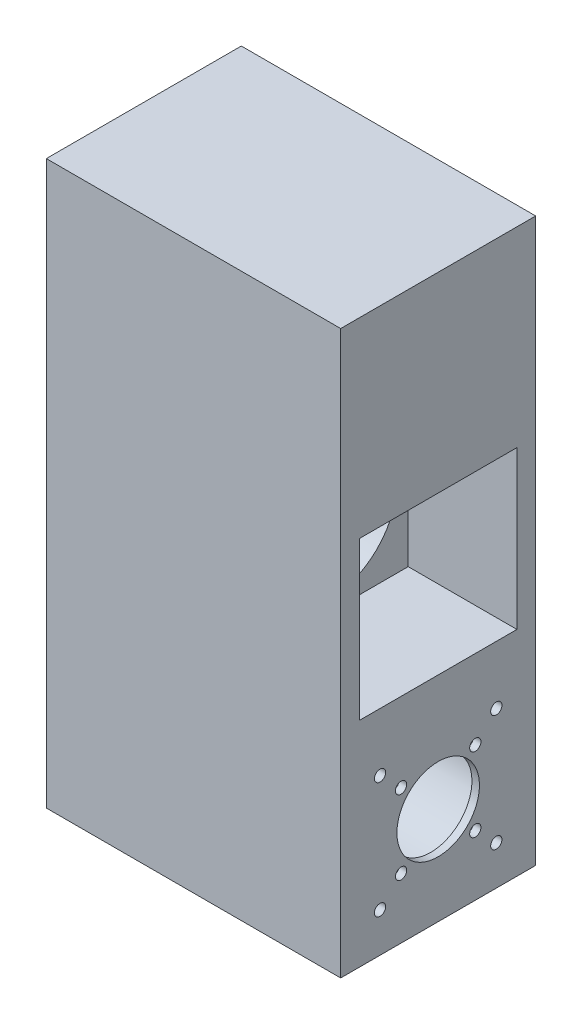
ISO-10303-21;
HEADER;
FILE_DESCRIPTION(('STEP AP214'),'2;1');
FILE_NAME('part.step','',(''),(''),'','','');
FILE_SCHEMA(('AUTOMOTIVE_DESIGN { 1 0 10303 214 1 1 1 1 }'));
ENDSEC;
DATA;
#1=APPLICATION_CONTEXT('core data for automotive mechanical design processes');
#2=APPLICATION_PROTOCOL_DEFINITION('international standard','automotive_design',2000,#1);
#3=PRODUCT_CONTEXT('',#1,'mechanical');
#4=PRODUCT('Part','Part','',(#3));
#5=PRODUCT_RELATED_PRODUCT_CATEGORY('part','',(#4));
#6=PRODUCT_DEFINITION_FORMATION('','',#4);
#7=PRODUCT_DEFINITION_CONTEXT('part definition',#1,'design');
#8=PRODUCT_DEFINITION('design','',#6,#7);
#9=PRODUCT_DEFINITION_SHAPE('','',#8);
#10=(LENGTH_UNIT() NAMED_UNIT(*) SI_UNIT(.MILLI.,.METRE.));
#11=(NAMED_UNIT(*) PLANE_ANGLE_UNIT() SI_UNIT($,.RADIAN.));
#12=(NAMED_UNIT(*) SI_UNIT($,.STERADIAN.) SOLID_ANGLE_UNIT());
#13=UNCERTAINTY_MEASURE_WITH_UNIT(LENGTH_MEASURE(1.E-05),#10,'distance_accuracy_value','');
#14=(GEOMETRIC_REPRESENTATION_CONTEXT(3) GLOBAL_UNCERTAINTY_ASSIGNED_CONTEXT((#13)) GLOBAL_UNIT_ASSIGNED_CONTEXT((#10,
#11,#12)) REPRESENTATION_CONTEXT('',''));
#15=CARTESIAN_POINT('',(0.,0.,0.));
#16=DIRECTION('',(0.,0.,1.));
#17=DIRECTION('',(1.,0.,0.));
#18=AXIS2_PLACEMENT_3D('',#15,#16,#17);
#19=CARTESIAN_POINT('',(-39.25,150.,-26.));
#20=DIRECTION('',(1.,0.,0.));
#21=DIRECTION('',(0.,0.,-1.));
#22=AXIS2_PLACEMENT_3D('',#19,#20,#21);
#23=PLANE('',#22);
#24=DIRECTION('',(0.,0.,1.));
#25=VECTOR('',#24,1.);
#26=CARTESIAN_POINT('',(-39.25,0.,-26.));
#27=LINE('',#26,#25);
#28=CARTESIAN_POINT('',(-39.25,0.,-26.));
#29=VERTEX_POINT('',#28);
#30=CARTESIAN_POINT('',(-39.25,0.,26.));
#31=VERTEX_POINT('',#30);
#32=EDGE_CURVE('E405',#29,#31,#27,.T.);
#33=ORIENTED_EDGE('',*,*,#32,.T.);
#34=DIRECTION('',(0.,-1.,0.));
#35=VECTOR('',#34,1.);
#36=CARTESIAN_POINT('',(-39.25,150.,26.));
#37=LINE('',#36,#35);
#38=CARTESIAN_POINT('',(-39.25,150.,26.));
#39=VERTEX_POINT('',#38);
#40=EDGE_CURVE('E413',#39,#31,#37,.T.);
#41=ORIENTED_EDGE('',*,*,#40,.F.);
#42=DIRECTION('',(0.,0.,1.));
#43=VECTOR('',#42,1.);
#44=CARTESIAN_POINT('',(-39.25,150.,-26.));
#45=LINE('',#44,#43);
#46=CARTESIAN_POINT('',(-39.25,150.,-26.));
#47=VERTEX_POINT('',#46);
#48=EDGE_CURVE('E392',#47,#39,#45,.T.);
#49=ORIENTED_EDGE('',*,*,#48,.F.);
#50=DIRECTION('',(0.,-1.,0.));
#51=VECTOR('',#50,1.);
#52=CARTESIAN_POINT('',(-39.25,150.,-26.));
#53=LINE('',#52,#51);
#54=EDGE_CURVE('E50',#47,#29,#53,.T.);
#55=ORIENTED_EDGE('',*,*,#54,.T.);
#56=EDGE_LOOP('',(#33,#41,#49,#55));
#57=FACE_BOUND('',#56,.T.);
#58=DIRECTION('',(0.,-1.,0.));
#59=VECTOR('',#58,1.);
#60=CARTESIAN_POINT('',(-39.25,47.,21.));
#61=LINE('',#60,#59);
#62=CARTESIAN_POINT('',(-39.25,47.,21.));
#63=VERTEX_POINT('',#62);
#64=CARTESIAN_POINT('',(-39.25,5.,21.));
#65=VERTEX_POINT('',#64);
#66=EDGE_CURVE('E360',#63,#65,#61,.T.);
#67=ORIENTED_EDGE('',*,*,#66,.T.);
#68=DIRECTION('',(0.,0.,1.));
#69=VECTOR('',#68,1.);
#70=CARTESIAN_POINT('',(-39.25,4.99999999999999,-21.));
#71=LINE('',#70,#69);
#72=CARTESIAN_POINT('',(-39.25,4.99999999999999,-21.));
#73=VERTEX_POINT('',#72);
#74=EDGE_CURVE('E338',#73,#65,#71,.T.);
#75=ORIENTED_EDGE('',*,*,#74,.F.);
#76=DIRECTION('',(0.,-1.,0.));
#77=VECTOR('',#76,1.);
#78=CARTESIAN_POINT('',(-39.25,47.,-21.));
#79=LINE('',#78,#77);
#80=CARTESIAN_POINT('',(-39.25,47.,-21.));
#81=VERTEX_POINT('',#80);
#82=EDGE_CURVE('E347',#81,#73,#79,.T.);
#83=ORIENTED_EDGE('',*,*,#82,.F.);
#84=DIRECTION('',(0.,0.,1.));
#85=VECTOR('',#84,1.);
#86=CARTESIAN_POINT('',(-39.25,47.,-21.));
#87=LINE('',#86,#85);
#88=EDGE_CURVE('E364',#81,#63,#87,.T.);
#89=ORIENTED_EDGE('',*,*,#88,.T.);
#90=EDGE_LOOP('',(#67,#75,#83,#89));
#91=FACE_BOUND('',#90,.T.);
#92=DIRECTION('',(0.,-1.,0.));
#93=VECTOR('',#92,1.);
#94=CARTESIAN_POINT('',(-39.25,0.,21.));
#95=LINE('',#94,#93);
#96=CARTESIAN_POINT('',(-39.25,145.,21.));
#97=VERTEX_POINT('',#96);
#98=CARTESIAN_POINT('',(-39.25,57.,21.));
#99=VERTEX_POINT('',#98);
#100=EDGE_CURVE('E65',#97,#99,#95,.T.);
#101=ORIENTED_EDGE('',*,*,#100,.T.);
#102=DIRECTION('',(0.,0.,1.));
#103=VECTOR('',#102,1.);
#104=CARTESIAN_POINT('',(-39.25,57.,0.));
#105=LINE('',#104,#103);
#106=CARTESIAN_POINT('',(-39.25,57.,-21.));
#107=VERTEX_POINT('',#106);
#108=EDGE_CURVE('E225',#107,#99,#105,.T.);
#109=ORIENTED_EDGE('',*,*,#108,.F.);
#110=DIRECTION('',(0.,-1.,0.));
#111=VECTOR('',#110,1.);
#112=CARTESIAN_POINT('',(-39.25,0.,-21.));
#113=LINE('',#112,#111);
#114=CARTESIAN_POINT('',(-39.25,145.,-21.));
#115=VERTEX_POINT('',#114);
#116=EDGE_CURVE('E243',#115,#107,#113,.T.);
#117=ORIENTED_EDGE('',*,*,#116,.F.);
#118=DIRECTION('',(0.,0.,1.));
#119=VECTOR('',#118,1.);
#120=CARTESIAN_POINT('',(-39.25,145.,0.));
#121=LINE('',#120,#119);
#122=EDGE_CURVE('E239',#115,#97,#121,.T.);
#123=ORIENTED_EDGE('',*,*,#122,.T.);
#124=EDGE_LOOP('',(#101,#109,#117,#123));
#125=FACE_BOUND('',#124,.T.);
#126=ADVANCED_FACE('F41',(#57,#91,#125),#23,.F.);
#127=CARTESIAN_POINT('',(39.25,150.,-26.));
#128=DIRECTION('',(-1.,0.,0.));
#129=DIRECTION('',(0.,0.,1.));
#130=AXIS2_PLACEMENT_3D('',#127,#128,#129);
#131=PLANE('',#130);
#132=DIRECTION('',(0.,1.,0.));
#133=VECTOR('',#132,1.);
#134=CARTESIAN_POINT('',(39.25,0.,-21.));
#135=LINE('',#134,#133);
#136=CARTESIAN_POINT('',(39.25,57.,-21.));
#137=VERTEX_POINT('',#136);
#138=CARTESIAN_POINT('',(39.25,99.,-21.));
#139=VERTEX_POINT('',#138);
#140=EDGE_CURVE('E616',#137,#139,#135,.T.);
#141=ORIENTED_EDGE('',*,*,#140,.F.);
#142=DIRECTION('',(0.,0.,-1.));
#143=VECTOR('',#142,1.);
#144=CARTESIAN_POINT('',(39.25,57.,0.));
#145=LINE('',#144,#143);
#146=CARTESIAN_POINT('',(39.25,57.,21.));
#147=VERTEX_POINT('',#146);
#148=EDGE_CURVE('E188',#147,#137,#145,.T.);
#149=ORIENTED_EDGE('',*,*,#148,.F.);
#150=DIRECTION('',(0.,-1.,0.));
#151=VECTOR('',#150,1.);
#152=CARTESIAN_POINT('',(39.25,0.,21.));
#153=LINE('',#152,#151);
#154=CARTESIAN_POINT('',(39.25,99.,21.));
#155=VERTEX_POINT('',#154);
#156=EDGE_CURVE('E159',#155,#147,#153,.T.);
#157=ORIENTED_EDGE('',*,*,#156,.F.);
#158=DIRECTION('',(0.,0.,-1.));
#159=VECTOR('',#158,1.);
#160=CARTESIAN_POINT('',(39.25,99.,0.));
#161=LINE('',#160,#159);
#162=EDGE_CURVE('E197',#155,#139,#161,.T.);
#163=ORIENTED_EDGE('',*,*,#162,.T.);
#164=EDGE_LOOP('',(#141,#149,#157,#163));
#165=FACE_BOUND('',#164,.T.);
#166=CARTESIAN_POINT('',(39.25,41.5,-15.5));
#167=DIRECTION('',(1.,0.,0.));
#168=DIRECTION('',(0.,0.,-1.));
#169=AXIS2_PLACEMENT_3D('',#166,#167,#168);
#170=CIRCLE('',#169,1.5);
#171=CARTESIAN_POINT('',(39.25,41.5,-17.));
#172=VERTEX_POINT('',#171);
#173=EDGE_CURVE('E274',#172,#172,#170,.T.);
#174=ORIENTED_EDGE('',*,*,#173,.F.);
#175=EDGE_LOOP('',(#174));
#176=FACE_BOUND('',#175,.T.);
#177=CARTESIAN_POINT('',(39.25,10.5,15.5));
#178=DIRECTION('',(1.,0.,0.));
#179=DIRECTION('',(0.,0.,-1.));
#180=AXIS2_PLACEMENT_3D('',#177,#178,#179);
#181=CIRCLE('',#180,1.5);
#182=CARTESIAN_POINT('',(39.25,10.5,14.));
#183=VERTEX_POINT('',#182);
#184=EDGE_CURVE('E275',#183,#183,#181,.T.);
#185=ORIENTED_EDGE('',*,*,#184,.F.);
#186=EDGE_LOOP('',(#185));
#187=FACE_BOUND('',#186,.T.);
#188=CARTESIAN_POINT('',(39.25,10.5,-15.5));
#189=DIRECTION('',(1.,0.,0.));
#190=DIRECTION('',(0.,0.,-1.));
#191=AXIS2_PLACEMENT_3D('',#188,#189,#190);
#192=CIRCLE('',#191,1.5);
#193=CARTESIAN_POINT('',(39.25,10.5,-17.));
#194=VERTEX_POINT('',#193);
#195=EDGE_CURVE('E265',#194,#194,#192,.T.);
#196=ORIENTED_EDGE('',*,*,#195,.F.);
#197=EDGE_LOOP('',(#196));
#198=FACE_BOUND('',#197,.T.);
#199=CARTESIAN_POINT('',(39.25,41.5,15.5));
#200=DIRECTION('',(1.,0.,0.));
#201=DIRECTION('',(0.,0.,-1.));
#202=AXIS2_PLACEMENT_3D('',#199,#200,#201);
#203=CIRCLE('',#202,1.5);
#204=CARTESIAN_POINT('',(39.25,41.5,14.));
#205=VERTEX_POINT('',#204);
#206=EDGE_CURVE('E279',#205,#205,#203,.T.);
#207=ORIENTED_EDGE('',*,*,#206,.F.);
#208=EDGE_LOOP('',(#207));
#209=FACE_BOUND('',#208,.T.);
#210=CARTESIAN_POINT('',(39.25,35.8994949366117,-9.89949493661168));
#211=DIRECTION('',(1.,0.,0.));
#212=DIRECTION('',(0.,0.,-1.));
#213=AXIS2_PLACEMENT_3D('',#210,#211,#212);
#214=CIRCLE('',#213,1.5);
#215=CARTESIAN_POINT('',(39.25,35.8994949366117,-11.3994949366117));
#216=VERTEX_POINT('',#215);
#217=EDGE_CURVE('E307',#216,#216,#214,.T.);
#218=ORIENTED_EDGE('',*,*,#217,.F.);
#219=EDGE_LOOP('',(#218));
#220=FACE_BOUND('',#219,.T.);
#221=CARTESIAN_POINT('',(39.25,16.1005050633883,9.89949493661165));
#222=DIRECTION('',(1.,0.,0.));
#223=DIRECTION('',(0.,0.,-1.));
#224=AXIS2_PLACEMENT_3D('',#221,#222,#223);
#225=CIRCLE('',#224,1.5);
#226=CARTESIAN_POINT('',(39.25,16.1005050633883,8.39949493661165));
#227=VERTEX_POINT('',#226);
#228=EDGE_CURVE('E298',#227,#227,#225,.T.);
#229=ORIENTED_EDGE('',*,*,#228,.F.);
#230=EDGE_LOOP('',(#229));
#231=FACE_BOUND('',#230,.T.);
#232=CARTESIAN_POINT('',(39.25,16.1005050633883,-9.89949493661168));
#233=DIRECTION('',(1.,0.,0.));
#234=DIRECTION('',(0.,0.,-1.));
#235=AXIS2_PLACEMENT_3D('',#232,#233,#234);
#236=CIRCLE('',#235,1.5);
#237=CARTESIAN_POINT('',(39.25,16.1005050633883,-11.3994949366117));
#238=VERTEX_POINT('',#237);
#239=EDGE_CURVE('E293',#238,#238,#236,.T.);
#240=ORIENTED_EDGE('',*,*,#239,.F.);
#241=EDGE_LOOP('',(#240));
#242=FACE_BOUND('',#241,.T.);
#243=CARTESIAN_POINT('',(39.25,35.8994949366117,9.89949493661164));
#244=DIRECTION('',(1.,0.,0.));
#245=DIRECTION('',(0.,0.,-1.));
#246=AXIS2_PLACEMENT_3D('',#243,#244,#245);
#247=CIRCLE('',#246,1.5);
#248=CARTESIAN_POINT('',(39.25,35.8994949366117,8.39949493661163));
#249=VERTEX_POINT('',#248);
#250=EDGE_CURVE('E318',#249,#249,#247,.T.);
#251=ORIENTED_EDGE('',*,*,#250,.F.);
#252=EDGE_LOOP('',(#251));
#253=FACE_BOUND('',#252,.T.);
#254=CARTESIAN_POINT('',(39.25,26.,0.));
#255=DIRECTION('',(-1.,0.,0.));
#256=DIRECTION('',(0.,0.,1.));
#257=AXIS2_PLACEMENT_3D('',#254,#255,#256);
#258=CIRCLE('',#257,11.);
#259=CARTESIAN_POINT('',(39.25,26.,11.));
#260=VERTEX_POINT('',#259);
#261=EDGE_CURVE('E329',#260,#260,#258,.F.);
#262=ORIENTED_EDGE('',*,*,#261,.F.);
#263=EDGE_LOOP('',(#262));
#264=FACE_BOUND('',#263,.T.);
#265=DIRECTION('',(0.,0.,-1.));
#266=VECTOR('',#265,1.);
#267=CARTESIAN_POINT('',(39.25,0.,-26.));
#268=LINE('',#267,#266);
#269=CARTESIAN_POINT('',(39.25,0.,26.));
#270=VERTEX_POINT('',#269);
#271=CARTESIAN_POINT('',(39.25,0.,-26.));
#272=VERTEX_POINT('',#271);
#273=EDGE_CURVE('E374',#270,#272,#268,.T.);
#274=ORIENTED_EDGE('',*,*,#273,.T.);
#275=DIRECTION('',(0.,-1.,0.));
#276=VECTOR('',#275,1.);
#277=CARTESIAN_POINT('',(39.25,150.,-26.));
#278=LINE('',#277,#276);
#279=CARTESIAN_POINT('',(39.25,150.,-26.));
#280=VERTEX_POINT('',#279);
#281=EDGE_CURVE('E11',#280,#272,#278,.T.);
#282=ORIENTED_EDGE('',*,*,#281,.F.);
#283=DIRECTION('',(0.,0.,-1.));
#284=VECTOR('',#283,1.);
#285=CARTESIAN_POINT('',(39.25,150.,-26.));
#286=LINE('',#285,#284);
#287=CARTESIAN_POINT('',(39.25,150.,26.));
#288=VERTEX_POINT('',#287);
#289=EDGE_CURVE('E384',#288,#280,#286,.T.);
#290=ORIENTED_EDGE('',*,*,#289,.F.);
#291=DIRECTION('',(0.,-1.,0.));
#292=VECTOR('',#291,1.);
#293=CARTESIAN_POINT('',(39.25,150.,26.));
#294=LINE('',#293,#292);
#295=EDGE_CURVE('E398',#288,#270,#294,.T.);
#296=ORIENTED_EDGE('',*,*,#295,.T.);
#297=EDGE_LOOP('',(#274,#282,#290,#296));
#298=FACE_BOUND('',#297,.T.);
#299=ADVANCED_FACE('F43',(#165,#176,#187,#198,#209,#220,#231,#242,#253,#264,#298),#131,.F.);
#300=CARTESIAN_POINT('',(-39.25,150.,-26.));
#301=DIRECTION('',(0.,0.,1.));
#302=DIRECTION('',(1.,0.,0.));
#303=AXIS2_PLACEMENT_3D('',#300,#301,#302);
#304=PLANE('',#303);
#305=DIRECTION('',(-1.,0.,0.));
#306=VECTOR('',#305,1.);
#307=CARTESIAN_POINT('',(-39.25,0.,-26.));
#308=LINE('',#307,#306);
#309=EDGE_CURVE('E402',#272,#29,#308,.T.);
#310=ORIENTED_EDGE('',*,*,#309,.T.);
#311=ORIENTED_EDGE('',*,*,#54,.F.);
#312=DIRECTION('',(-1.,0.,0.));
#313=VECTOR('',#312,1.);
#314=CARTESIAN_POINT('',(-39.25,150.,-26.));
#315=LINE('',#314,#313);
#316=EDGE_CURVE('E388',#280,#47,#315,.T.);
#317=ORIENTED_EDGE('',*,*,#316,.F.);
#318=ORIENTED_EDGE('',*,*,#281,.T.);
#319=EDGE_LOOP('',(#310,#311,#317,#318));
#320=FACE_BOUND('',#319,.T.);
#321=ADVANCED_FACE('F438',(#320),#304,.F.);
#322=CARTESIAN_POINT('',(-39.25,150.,26.));
#323=DIRECTION('',(0.,0.,-1.));
#324=DIRECTION('',(-1.,0.,0.));
#325=AXIS2_PLACEMENT_3D('',#322,#323,#324);
#326=PLANE('',#325);
#327=DIRECTION('',(1.,0.,0.));
#328=VECTOR('',#327,1.);
#329=CARTESIAN_POINT('',(-39.25,0.,26.));
#330=LINE('',#329,#328);
#331=EDGE_CURVE('E389',#31,#270,#330,.T.);
#332=ORIENTED_EDGE('',*,*,#331,.T.);
#333=ORIENTED_EDGE('',*,*,#295,.F.);
#334=DIRECTION('',(1.,0.,0.));
#335=VECTOR('',#334,1.);
#336=CARTESIAN_POINT('',(-39.25,150.,26.));
#337=LINE('',#336,#335);
#338=EDGE_CURVE('E395',#39,#288,#337,.T.);
#339=ORIENTED_EDGE('',*,*,#338,.F.);
#340=ORIENTED_EDGE('',*,*,#40,.T.);
#341=EDGE_LOOP('',(#332,#333,#339,#340));
#342=FACE_BOUND('',#341,.T.);
#343=ADVANCED_FACE('F431',(#342),#326,.F.);
#344=CARTESIAN_POINT('',(0.,150.,0.));
#345=DIRECTION('',(0.,1.,0.));
#346=DIRECTION('',(0.,0.,1.));
#347=AXIS2_PLACEMENT_3D('',#344,#345,#346);
#348=PLANE('',#347);
#349=ORIENTED_EDGE('',*,*,#289,.T.);
#350=ORIENTED_EDGE('',*,*,#316,.T.);
#351=ORIENTED_EDGE('',*,*,#48,.T.);
#352=ORIENTED_EDGE('',*,*,#338,.T.);
#353=EDGE_LOOP('',(#349,#350,#351,#352));
#354=FACE_BOUND('',#353,.T.);
#355=ADVANCED_FACE('F437',(#354),#348,.T.);
#356=CARTESIAN_POINT('',(0.,0.,0.));
#357=DIRECTION('',(0.,1.,0.));
#358=DIRECTION('',(0.,0.,1.));
#359=AXIS2_PLACEMENT_3D('',#356,#357,#358);
#360=PLANE('',#359);
#361=ORIENTED_EDGE('',*,*,#273,.F.);
#362=ORIENTED_EDGE('',*,*,#331,.F.);
#363=ORIENTED_EDGE('',*,*,#32,.F.);
#364=ORIENTED_EDGE('',*,*,#309,.F.);
#365=EDGE_LOOP('',(#361,#362,#363,#364));
#366=FACE_BOUND('',#365,.T.);
#367=ADVANCED_FACE('F428',(#366),#360,.F.);
#368=CARTESIAN_POINT('',(-1.25,4.99999999999999,-21.));
#369=DIRECTION('',(0.,-1.,0.));
#370=DIRECTION('',(0.,0.,-1.));
#371=AXIS2_PLACEMENT_3D('',#368,#369,#370);
#372=PLANE('',#371);
#373=ORIENTED_EDGE('',*,*,#74,.T.);
#374=DIRECTION('',(-1.,0.,0.));
#375=VECTOR('',#374,1.);
#376=CARTESIAN_POINT('',(-1.25,4.99999999999999,21.));
#377=LINE('',#376,#375);
#378=CARTESIAN_POINT('',(-1.25,4.99999999999999,21.));
#379=VERTEX_POINT('',#378);
#380=EDGE_CURVE('E357',#379,#65,#377,.T.);
#381=ORIENTED_EDGE('',*,*,#380,.F.);
#382=DIRECTION('',(0.,0.,1.));
#383=VECTOR('',#382,1.);
#384=CARTESIAN_POINT('',(-1.25,4.99999999999999,-21.));
#385=LINE('',#384,#383);
#386=CARTESIAN_POINT('',(-1.25,4.99999999999999,-21.));
#387=VERTEX_POINT('',#386);
#388=EDGE_CURVE('E342',#387,#379,#385,.T.);
#389=ORIENTED_EDGE('',*,*,#388,.F.);
#390=DIRECTION('',(-1.,0.,0.));
#391=VECTOR('',#390,1.);
#392=CARTESIAN_POINT('',(-1.25,4.99999999999999,-21.));
#393=LINE('',#392,#391);
#394=EDGE_CURVE('E371',#387,#73,#393,.T.);
#395=ORIENTED_EDGE('',*,*,#394,.T.);
#396=EDGE_LOOP('',(#373,#381,#389,#395));
#397=FACE_BOUND('',#396,.T.);
#398=ADVANCED_FACE('F453',(#397),#372,.F.);
#399=CARTESIAN_POINT('',(-1.25,47.,-21.));
#400=DIRECTION('',(0.,0.,-1.));
#401=DIRECTION('',(0.,1.,0.));
#402=AXIS2_PLACEMENT_3D('',#399,#400,#401);
#403=PLANE('',#402);
#404=ORIENTED_EDGE('',*,*,#82,.T.);
#405=ORIENTED_EDGE('',*,*,#394,.F.);
#406=DIRECTION('',(0.,-1.,0.));
#407=VECTOR('',#406,1.);
#408=CARTESIAN_POINT('',(-1.25,47.,-21.));
#409=LINE('',#408,#407);
#410=CARTESIAN_POINT('',(-1.25,47.,-21.));
#411=VERTEX_POINT('',#410);
#412=EDGE_CURVE('E353',#411,#387,#409,.T.);
#413=ORIENTED_EDGE('',*,*,#412,.F.);
#414=DIRECTION('',(-1.,0.,0.));
#415=VECTOR('',#414,1.);
#416=CARTESIAN_POINT('',(-1.25,47.,-21.));
#417=LINE('',#416,#415);
#418=EDGE_CURVE('E375',#411,#81,#417,.T.);
#419=ORIENTED_EDGE('',*,*,#418,.T.);
#420=EDGE_LOOP('',(#404,#405,#413,#419));
#421=FACE_BOUND('',#420,.T.);
#422=ADVANCED_FACE('F458',(#421),#403,.F.);
#423=CARTESIAN_POINT('',(-1.25,47.,-21.));
#424=DIRECTION('',(0.,-1.,0.));
#425=DIRECTION('',(0.,0.,-1.));
#426=AXIS2_PLACEMENT_3D('',#423,#424,#425);
#427=PLANE('',#426);
#428=ORIENTED_EDGE('',*,*,#88,.F.);
#429=ORIENTED_EDGE('',*,*,#418,.F.);
#430=DIRECTION('',(0.,0.,1.));
#431=VECTOR('',#430,1.);
#432=CARTESIAN_POINT('',(-1.25,47.,-21.));
#433=LINE('',#432,#431);
#434=CARTESIAN_POINT('',(-1.25,47.,21.));
#435=VERTEX_POINT('',#434);
#436=EDGE_CURVE('E350',#411,#435,#433,.T.);
#437=ORIENTED_EDGE('',*,*,#436,.T.);
#438=DIRECTION('',(-1.,0.,0.));
#439=VECTOR('',#438,1.);
#440=CARTESIAN_POINT('',(-1.25,47.,21.));
#441=LINE('',#440,#439);
#442=EDGE_CURVE('E378',#435,#63,#441,.T.);
#443=ORIENTED_EDGE('',*,*,#442,.T.);
#444=EDGE_LOOP('',(#428,#429,#437,#443));
#445=FACE_BOUND('',#444,.T.);
#446=ADVANCED_FACE('F464',(#445),#427,.T.);
#447=CARTESIAN_POINT('',(-1.25,47.,21.));
#448=DIRECTION('',(0.,0.,-1.));
#449=DIRECTION('',(0.,1.,0.));
#450=AXIS2_PLACEMENT_3D('',#447,#448,#449);
#451=PLANE('',#450);
#452=ORIENTED_EDGE('',*,*,#66,.F.);
#453=ORIENTED_EDGE('',*,*,#442,.F.);
#454=DIRECTION('',(0.,-1.,0.));
#455=VECTOR('',#454,1.);
#456=CARTESIAN_POINT('',(-1.25,47.,21.));
#457=LINE('',#456,#455);
#458=EDGE_CURVE('E346',#435,#379,#457,.T.);
#459=ORIENTED_EDGE('',*,*,#458,.T.);
#460=ORIENTED_EDGE('',*,*,#380,.T.);
#461=EDGE_LOOP('',(#452,#453,#459,#460));
#462=FACE_BOUND('',#461,.T.);
#463=ADVANCED_FACE('F460',(#462),#451,.T.);
#464=CARTESIAN_POINT('',(-1.25,0.,0.));
#465=DIRECTION('',(1.,0.,0.));
#466=DIRECTION('',(0.,0.,-1.));
#467=AXIS2_PLACEMENT_3D('',#464,#465,#466);
#468=PLANE('',#467);
#469=CARTESIAN_POINT('',(-1.25,41.5,-15.5));
#470=DIRECTION('',(1.,0.,0.));
#471=DIRECTION('',(0.,0.,-1.));
#472=AXIS2_PLACEMENT_3D('',#469,#470,#471);
#473=CIRCLE('',#472,1.5);
#474=CARTESIAN_POINT('',(-1.25,41.5,-17.));
#475=VERTEX_POINT('',#474);
#476=EDGE_CURVE('E270',#475,#475,#473,.F.);
#477=ORIENTED_EDGE('',*,*,#476,.F.);
#478=EDGE_LOOP('',(#477));
#479=FACE_BOUND('',#478,.T.);
#480=CARTESIAN_POINT('',(-1.25,10.5,15.5));
#481=DIRECTION('',(1.,0.,0.));
#482=DIRECTION('',(0.,0.,-1.));
#483=AXIS2_PLACEMENT_3D('',#480,#481,#482);
#484=CIRCLE('',#483,1.5);
#485=CARTESIAN_POINT('',(-1.25,10.5,14.));
#486=VERTEX_POINT('',#485);
#487=EDGE_CURVE('E269',#486,#486,#484,.F.);
#488=ORIENTED_EDGE('',*,*,#487,.F.);
#489=EDGE_LOOP('',(#488));
#490=FACE_BOUND('',#489,.T.);
#491=CARTESIAN_POINT('',(-1.25,10.5,-15.5));
#492=DIRECTION('',(1.,0.,0.));
#493=DIRECTION('',(0.,0.,-1.));
#494=AXIS2_PLACEMENT_3D('',#491,#492,#493);
#495=CIRCLE('',#494,1.5);
#496=CARTESIAN_POINT('',(-1.25,10.5,-17.));
#497=VERTEX_POINT('',#496);
#498=EDGE_CURVE('E253',#497,#497,#495,.F.);
#499=ORIENTED_EDGE('',*,*,#498,.F.);
#500=EDGE_LOOP('',(#499));
#501=FACE_BOUND('',#500,.T.);
#502=CARTESIAN_POINT('',(-1.25,41.5,15.5));
#503=DIRECTION('',(1.,0.,0.));
#504=DIRECTION('',(0.,0.,-1.));
#505=AXIS2_PLACEMENT_3D('',#502,#503,#504);
#506=CIRCLE('',#505,1.5);
#507=CARTESIAN_POINT('',(-1.25,41.5,14.));
#508=VERTEX_POINT('',#507);
#509=EDGE_CURVE('E289',#508,#508,#506,.F.);
#510=ORIENTED_EDGE('',*,*,#509,.F.);
#511=EDGE_LOOP('',(#510));
#512=FACE_BOUND('',#511,.T.);
#513=CARTESIAN_POINT('',(-1.25,26.,0.));
#514=DIRECTION('',(-1.,0.,0.));
#515=DIRECTION('',(0.,0.,1.));
#516=AXIS2_PLACEMENT_3D('',#513,#514,#515);
#517=CIRCLE('',#516,18.);
#518=CARTESIAN_POINT('',(-1.25,26.,18.));
#519=VERTEX_POINT('',#518);
#520=EDGE_CURVE('E333',#519,#519,#517,.T.);
#521=ORIENTED_EDGE('',*,*,#520,.F.);
#522=EDGE_LOOP('',(#521));
#523=FACE_BOUND('',#522,.T.);
#524=ORIENTED_EDGE('',*,*,#388,.T.);
#525=ORIENTED_EDGE('',*,*,#458,.F.);
#526=ORIENTED_EDGE('',*,*,#436,.F.);
#527=ORIENTED_EDGE('',*,*,#412,.T.);
#528=EDGE_LOOP('',(#524,#525,#526,#527));
#529=FACE_BOUND('',#528,.T.);
#530=ADVANCED_FACE('F463',(#479,#490,#501,#512,#523,#529),#468,.F.);
#531=CARTESIAN_POINT('',(37.25,26.,0.));
#532=DIRECTION('',(-1.,0.,0.));
#533=DIRECTION('',(0.,0.,1.));
#534=AXIS2_PLACEMENT_3D('',#531,#532,#533);
#535=CYLINDRICAL_SURFACE('',#534,18.);
#536=CARTESIAN_POINT('',(37.25,26.,0.));
#537=DIRECTION('',(-1.,0.,0.));
#538=DIRECTION('',(0.,0.,1.));
#539=AXIS2_PLACEMENT_3D('',#536,#537,#538);
#540=CIRCLE('',#539,18.);
#541=CARTESIAN_POINT('',(37.25,26.,18.));
#542=VERTEX_POINT('',#541);
#543=EDGE_CURVE('E334',#542,#542,#540,.T.);
#544=ORIENTED_EDGE('',*,*,#543,.F.);
#545=EDGE_LOOP('',(#544));
#546=FACE_BOUND('',#545,.T.);
#547=ORIENTED_EDGE('',*,*,#520,.T.);
#548=EDGE_LOOP('',(#547));
#549=FACE_BOUND('',#548,.T.);
#550=ADVANCED_FACE('F474',(#546,#549),#535,.F.);
#551=CARTESIAN_POINT('',(37.25,26.,0.));
#552=DIRECTION('',(-1.,0.,0.));
#553=DIRECTION('',(0.,0.,1.));
#554=AXIS2_PLACEMENT_3D('',#551,#552,#553);
#555=PLANE('',#554);
#556=CARTESIAN_POINT('',(37.25,35.8994949366117,-9.89949493661168));
#557=DIRECTION('',(-1.,0.,0.));
#558=DIRECTION('',(0.,0.,1.));
#559=AXIS2_PLACEMENT_3D('',#556,#557,#558);
#560=CIRCLE('',#559,1.5);
#561=CARTESIAN_POINT('',(37.25,35.8994949366117,-8.39949493661168));
#562=VERTEX_POINT('',#561);
#563=EDGE_CURVE('E302',#562,#562,#560,.F.);
#564=ORIENTED_EDGE('',*,*,#563,.T.);
#565=EDGE_LOOP('',(#564));
#566=FACE_BOUND('',#565,.T.);
#567=CARTESIAN_POINT('',(37.25,16.1005050633883,9.89949493661165));
#568=DIRECTION('',(-1.,0.,0.));
#569=DIRECTION('',(0.,0.,1.));
#570=AXIS2_PLACEMENT_3D('',#567,#568,#569);
#571=CIRCLE('',#570,1.5);
#572=CARTESIAN_POINT('',(37.25,16.1005050633883,11.3994949366116));
#573=VERTEX_POINT('',#572);
#574=EDGE_CURVE('E311',#573,#573,#571,.F.);
#575=ORIENTED_EDGE('',*,*,#574,.T.);
#576=EDGE_LOOP('',(#575));
#577=FACE_BOUND('',#576,.T.);
#578=CARTESIAN_POINT('',(37.25,16.1005050633883,-9.89949493661168));
#579=DIRECTION('',(-1.,0.,0.));
#580=DIRECTION('',(0.,0.,1.));
#581=AXIS2_PLACEMENT_3D('',#578,#579,#580);
#582=CIRCLE('',#581,1.5);
#583=CARTESIAN_POINT('',(37.25,16.1005050633883,-8.39949493661168));
#584=VERTEX_POINT('',#583);
#585=EDGE_CURVE('E294',#584,#584,#582,.F.);
#586=ORIENTED_EDGE('',*,*,#585,.T.);
#587=EDGE_LOOP('',(#586));
#588=FACE_BOUND('',#587,.T.);
#589=CARTESIAN_POINT('',(37.25,35.8994949366117,9.89949493661164));
#590=DIRECTION('',(-1.,0.,0.));
#591=DIRECTION('',(0.,0.,1.));
#592=AXIS2_PLACEMENT_3D('',#589,#590,#591);
#593=CIRCLE('',#592,1.5);
#594=CARTESIAN_POINT('',(37.25,35.8994949366117,11.3994949366116));
#595=VERTEX_POINT('',#594);
#596=EDGE_CURVE('E306',#595,#595,#593,.F.);
#597=ORIENTED_EDGE('',*,*,#596,.T.);
#598=EDGE_LOOP('',(#597));
#599=FACE_BOUND('',#598,.T.);
#600=CARTESIAN_POINT('',(37.25,26.,0.));
#601=DIRECTION('',(-1.,0.,0.));
#602=DIRECTION('',(0.,0.,1.));
#603=AXIS2_PLACEMENT_3D('',#600,#601,#602);
#604=CIRCLE('',#603,11.);
#605=CARTESIAN_POINT('',(37.25,26.,11.));
#606=VERTEX_POINT('',#605);
#607=EDGE_CURVE('E322',#606,#606,#604,.T.);
#608=ORIENTED_EDGE('',*,*,#607,.F.);
#609=EDGE_LOOP('',(#608));
#610=FACE_BOUND('',#609,.T.);
#611=ORIENTED_EDGE('',*,*,#543,.T.);
#612=EDGE_LOOP('',(#611));
#613=FACE_BOUND('',#612,.T.);
#614=ADVANCED_FACE('F478',(#566,#577,#588,#599,#610,#613),#555,.T.);
#615=CARTESIAN_POINT('',(39.251,26.,0.));
#616=DIRECTION('',(-1.,0.,0.));
#617=DIRECTION('',(0.,0.,1.));
#618=AXIS2_PLACEMENT_3D('',#615,#616,#617);
#619=CYLINDRICAL_SURFACE('',#618,11.);
#620=ORIENTED_EDGE('',*,*,#607,.T.);
#621=EDGE_LOOP('',(#620));
#622=FACE_BOUND('',#621,.T.);
#623=ORIENTED_EDGE('',*,*,#261,.T.);
#624=EDGE_LOOP('',(#623));
#625=FACE_BOUND('',#624,.T.);
#626=ADVANCED_FACE('F482',(#622,#625),#619,.F.);
#627=CARTESIAN_POINT('',(-39.251,35.8994949366117,9.89949493661164));
#628=DIRECTION('',(1.,0.,0.));
#629=DIRECTION('',(0.,0.,-1.));
#630=AXIS2_PLACEMENT_3D('',#627,#628,#629);
#631=CYLINDRICAL_SURFACE('',#630,1.5);
#632=ORIENTED_EDGE('',*,*,#596,.F.);
#633=EDGE_LOOP('',(#632));
#634=FACE_BOUND('',#633,.T.);
#635=ORIENTED_EDGE('',*,*,#250,.T.);
#636=EDGE_LOOP('',(#635));
#637=FACE_BOUND('',#636,.T.);
#638=ADVANCED_FACE('F486',(#634,#637),#631,.F.);
#639=CARTESIAN_POINT('',(-39.251,16.1005050633883,-9.89949493661168));
#640=DIRECTION('',(1.,0.,0.));
#641=DIRECTION('',(0.,0.,-1.));
#642=AXIS2_PLACEMENT_3D('',#639,#640,#641);
#643=CYLINDRICAL_SURFACE('',#642,1.5);
#644=ORIENTED_EDGE('',*,*,#585,.F.);
#645=EDGE_LOOP('',(#644));
#646=FACE_BOUND('',#645,.T.);
#647=ORIENTED_EDGE('',*,*,#239,.T.);
#648=EDGE_LOOP('',(#647));
#649=FACE_BOUND('',#648,.T.);
#650=ADVANCED_FACE('F490',(#646,#649),#643,.F.);
#651=CARTESIAN_POINT('',(-39.251,16.1005050633883,9.89949493661165));
#652=DIRECTION('',(1.,0.,0.));
#653=DIRECTION('',(0.,0.,-1.));
#654=AXIS2_PLACEMENT_3D('',#651,#652,#653);
#655=CYLINDRICAL_SURFACE('',#654,1.5);
#656=ORIENTED_EDGE('',*,*,#574,.F.);
#657=EDGE_LOOP('',(#656));
#658=FACE_BOUND('',#657,.T.);
#659=ORIENTED_EDGE('',*,*,#228,.T.);
#660=EDGE_LOOP('',(#659));
#661=FACE_BOUND('',#660,.T.);
#662=ADVANCED_FACE('F492',(#658,#661),#655,.F.);
#663=CARTESIAN_POINT('',(-39.251,35.8994949366117,-9.89949493661168));
#664=DIRECTION('',(1.,0.,0.));
#665=DIRECTION('',(0.,0.,-1.));
#666=AXIS2_PLACEMENT_3D('',#663,#664,#665);
#667=CYLINDRICAL_SURFACE('',#666,1.5);
#668=ORIENTED_EDGE('',*,*,#563,.F.);
#669=EDGE_LOOP('',(#668));
#670=FACE_BOUND('',#669,.T.);
#671=ORIENTED_EDGE('',*,*,#217,.T.);
#672=EDGE_LOOP('',(#671));
#673=FACE_BOUND('',#672,.T.);
#674=ADVANCED_FACE('F495',(#670,#673),#667,.F.);
#675=CARTESIAN_POINT('',(-39.251,41.5,15.5));
#676=DIRECTION('',(1.,0.,0.));
#677=DIRECTION('',(0.,0.,-1.));
#678=AXIS2_PLACEMENT_3D('',#675,#676,#677);
#679=CYLINDRICAL_SURFACE('',#678,1.5);
#680=ORIENTED_EDGE('',*,*,#206,.T.);
#681=EDGE_LOOP('',(#680));
#682=FACE_BOUND('',#681,.T.);
#683=ORIENTED_EDGE('',*,*,#509,.T.);
#684=EDGE_LOOP('',(#683));
#685=FACE_BOUND('',#684,.T.);
#686=ADVANCED_FACE('F499',(#682,#685),#679,.F.);
#687=CARTESIAN_POINT('',(-39.251,10.5,-15.5));
#688=DIRECTION('',(1.,0.,0.));
#689=DIRECTION('',(0.,0.,-1.));
#690=AXIS2_PLACEMENT_3D('',#687,#688,#689);
#691=CYLINDRICAL_SURFACE('',#690,1.5);
#692=ORIENTED_EDGE('',*,*,#195,.T.);
#693=EDGE_LOOP('',(#692));
#694=FACE_BOUND('',#693,.T.);
#695=ORIENTED_EDGE('',*,*,#498,.T.);
#696=EDGE_LOOP('',(#695));
#697=FACE_BOUND('',#696,.T.);
#698=ADVANCED_FACE('F506',(#694,#697),#691,.F.);
#699=CARTESIAN_POINT('',(-39.251,10.5,15.5));
#700=DIRECTION('',(1.,0.,0.));
#701=DIRECTION('',(0.,0.,-1.));
#702=AXIS2_PLACEMENT_3D('',#699,#700,#701);
#703=CYLINDRICAL_SURFACE('',#702,1.5);
#704=ORIENTED_EDGE('',*,*,#184,.T.);
#705=EDGE_LOOP('',(#704));
#706=FACE_BOUND('',#705,.T.);
#707=ORIENTED_EDGE('',*,*,#487,.T.);
#708=EDGE_LOOP('',(#707));
#709=FACE_BOUND('',#708,.T.);
#710=ADVANCED_FACE('F508',(#706,#709),#703,.F.);
#711=CARTESIAN_POINT('',(-39.251,41.5,-15.5));
#712=DIRECTION('',(1.,0.,0.));
#713=DIRECTION('',(0.,0.,-1.));
#714=AXIS2_PLACEMENT_3D('',#711,#712,#713);
#715=CYLINDRICAL_SURFACE('',#714,1.5);
#716=ORIENTED_EDGE('',*,*,#173,.T.);
#717=EDGE_LOOP('',(#716));
#718=FACE_BOUND('',#717,.T.);
#719=ORIENTED_EDGE('',*,*,#476,.T.);
#720=EDGE_LOOP('',(#719));
#721=FACE_BOUND('',#720,.T.);
#722=ADVANCED_FACE('F511',(#718,#721),#715,.F.);
#723=CARTESIAN_POINT('',(-19.25,0.,21.));
#724=DIRECTION('',(0.,0.,-1.));
#725=DIRECTION('',(-1.,0.,0.));
#726=AXIS2_PLACEMENT_3D('',#723,#724,#725);
#727=PLANE('',#726);
#728=ORIENTED_EDGE('',*,*,#100,.F.);
#729=DIRECTION('',(-1.,0.,0.));
#730=VECTOR('',#729,1.);
#731=CARTESIAN_POINT('',(-19.25,145.,21.));
#732=LINE('',#731,#730);
#733=CARTESIAN_POINT('',(-19.25,145.,21.));
#734=VERTEX_POINT('',#733);
#735=EDGE_CURVE('E236',#734,#97,#732,.T.);
#736=ORIENTED_EDGE('',*,*,#735,.F.);
#737=DIRECTION('',(0.,-1.,0.));
#738=VECTOR('',#737,1.);
#739=CARTESIAN_POINT('',(-19.25,0.,21.));
#740=LINE('',#739,#738);
#741=CARTESIAN_POINT('',(-19.25,57.,21.));
#742=VERTEX_POINT('',#741);
#743=EDGE_CURVE('E221',#734,#742,#740,.T.);
#744=ORIENTED_EDGE('',*,*,#743,.T.);
#745=DIRECTION('',(-1.,0.,0.));
#746=VECTOR('',#745,1.);
#747=CARTESIAN_POINT('',(-19.25,57.,21.));
#748=LINE('',#747,#746);
#749=EDGE_CURVE('E250',#742,#99,#748,.T.);
#750=ORIENTED_EDGE('',*,*,#749,.T.);
#751=EDGE_LOOP('',(#728,#736,#744,#750));
#752=FACE_BOUND('',#751,.T.);
#753=ADVANCED_FACE('F515',(#752),#727,.T.);
#754=CARTESIAN_POINT('',(-19.25,57.,0.));
#755=DIRECTION('',(0.,-1.,0.));
#756=DIRECTION('',(0.,0.,-1.));
#757=AXIS2_PLACEMENT_3D('',#754,#755,#756);
#758=PLANE('',#757);
#759=ORIENTED_EDGE('',*,*,#108,.T.);
#760=ORIENTED_EDGE('',*,*,#749,.F.);
#761=DIRECTION('',(0.,0.,1.));
#762=VECTOR('',#761,1.);
#763=CARTESIAN_POINT('',(-19.25,57.,0.));
#764=LINE('',#763,#762);
#765=CARTESIAN_POINT('',(-19.25,57.,-21.));
#766=VERTEX_POINT('',#765);
#767=EDGE_CURVE('E232',#766,#742,#764,.T.);
#768=ORIENTED_EDGE('',*,*,#767,.F.);
#769=DIRECTION('',(-1.,0.,0.));
#770=VECTOR('',#769,1.);
#771=CARTESIAN_POINT('',(-19.25,57.,-21.));
#772=LINE('',#771,#770);
#773=EDGE_CURVE('E254',#766,#107,#772,.T.);
#774=ORIENTED_EDGE('',*,*,#773,.T.);
#775=EDGE_LOOP('',(#759,#760,#768,#774));
#776=FACE_BOUND('',#775,.T.);
#777=ADVANCED_FACE('F522',(#776),#758,.F.);
#778=CARTESIAN_POINT('',(-19.25,0.,-21.));
#779=DIRECTION('',(0.,0.,-1.));
#780=DIRECTION('',(-1.,0.,0.));
#781=AXIS2_PLACEMENT_3D('',#778,#779,#780);
#782=PLANE('',#781);
#783=ORIENTED_EDGE('',*,*,#116,.T.);
#784=ORIENTED_EDGE('',*,*,#773,.F.);
#785=DIRECTION('',(0.,-1.,0.));
#786=VECTOR('',#785,1.);
#787=CARTESIAN_POINT('',(-19.25,0.,-21.));
#788=LINE('',#787,#786);
#789=CARTESIAN_POINT('',(-19.25,145.,-21.));
#790=VERTEX_POINT('',#789);
#791=EDGE_CURVE('E228',#790,#766,#788,.T.);
#792=ORIENTED_EDGE('',*,*,#791,.F.);
#793=DIRECTION('',(-1.,0.,0.));
#794=VECTOR('',#793,1.);
#795=CARTESIAN_POINT('',(-19.25,145.,-21.));
#796=LINE('',#795,#794);
#797=EDGE_CURVE('E257',#790,#115,#796,.T.);
#798=ORIENTED_EDGE('',*,*,#797,.T.);
#799=EDGE_LOOP('',(#783,#784,#792,#798));
#800=FACE_BOUND('',#799,.T.);
#801=ADVANCED_FACE('F527',(#800),#782,.F.);
#802=CARTESIAN_POINT('',(-19.25,145.,0.));
#803=DIRECTION('',(0.,-1.,0.));
#804=DIRECTION('',(0.,0.,-1.));
#805=AXIS2_PLACEMENT_3D('',#802,#803,#804);
#806=PLANE('',#805);
#807=ORIENTED_EDGE('',*,*,#122,.F.);
#808=ORIENTED_EDGE('',*,*,#797,.F.);
#809=DIRECTION('',(0.,0.,1.));
#810=VECTOR('',#809,1.);
#811=CARTESIAN_POINT('',(-19.25,145.,0.));
#812=LINE('',#811,#810);
#813=EDGE_CURVE('E224',#790,#734,#812,.T.);
#814=ORIENTED_EDGE('',*,*,#813,.T.);
#815=ORIENTED_EDGE('',*,*,#735,.T.);
#816=EDGE_LOOP('',(#807,#808,#814,#815));
#817=FACE_BOUND('',#816,.T.);
#818=ADVANCED_FACE('F523',(#817),#806,.T.);
#819=CARTESIAN_POINT('',(-19.25,0.,0.));
#820=DIRECTION('',(-1.,0.,0.));
#821=DIRECTION('',(0.,0.,1.));
#822=AXIS2_PLACEMENT_3D('',#819,#820,#821);
#823=PLANE('',#822);
#824=CARTESIAN_POINT('',(-19.25,68.1005050633883,-9.89949493661168));
#825=DIRECTION('',(-1.,0.,0.));
#826=DIRECTION('',(0.,0.,1.));
#827=AXIS2_PLACEMENT_3D('',#824,#825,#826);
#828=CIRCLE('',#827,1.5);
#829=CARTESIAN_POINT('',(-19.25,68.1005050633883,-8.39949493661168));
#830=VERTEX_POINT('',#829);
#831=EDGE_CURVE('E602',#830,#830,#828,.T.);
#832=ORIENTED_EDGE('',*,*,#831,.F.);
#833=EDGE_LOOP('',(#832));
#834=FACE_BOUND('',#833,.T.);
#835=CARTESIAN_POINT('',(-19.25,68.1005050633884,9.89949493661163));
#836=DIRECTION('',(-1.,0.,0.));
#837=DIRECTION('',(0.,0.,1.));
#838=AXIS2_PLACEMENT_3D('',#835,#836,#837);
#839=CIRCLE('',#838,1.5);
#840=CARTESIAN_POINT('',(-19.25,68.1005050633884,11.3994949366116));
#841=VERTEX_POINT('',#840);
#842=EDGE_CURVE('E591',#841,#841,#839,.T.);
#843=ORIENTED_EDGE('',*,*,#842,.F.);
#844=EDGE_LOOP('',(#843));
#845=FACE_BOUND('',#844,.T.);
#846=CARTESIAN_POINT('',(-19.25,87.8994949366117,9.89949493661164));
#847=DIRECTION('',(-1.,0.,0.));
#848=DIRECTION('',(0.,0.,1.));
#849=AXIS2_PLACEMENT_3D('',#846,#847,#848);
#850=CIRCLE('',#849,1.5);
#851=CARTESIAN_POINT('',(-19.25,87.8994949366117,11.3994949366116));
#852=VERTEX_POINT('',#851);
#853=EDGE_CURVE('E585',#852,#852,#850,.T.);
#854=ORIENTED_EDGE('',*,*,#853,.F.);
#855=EDGE_LOOP('',(#854));
#856=FACE_BOUND('',#855,.T.);
#857=CARTESIAN_POINT('',(-19.25,87.8994949366117,-9.89949493661169));
#858=DIRECTION('',(-1.,0.,0.));
#859=DIRECTION('',(0.,0.,1.));
#860=AXIS2_PLACEMENT_3D('',#857,#858,#859);
#861=CIRCLE('',#860,1.5);
#862=CARTESIAN_POINT('',(-19.25,87.8994949366117,-8.3994949366117));
#863=VERTEX_POINT('',#862);
#864=EDGE_CURVE('E185',#863,#863,#861,.T.);
#865=ORIENTED_EDGE('',*,*,#864,.F.);
#866=EDGE_LOOP('',(#865));
#867=FACE_BOUND('',#866,.T.);
#868=CARTESIAN_POINT('',(-19.25,78.,0.));
#869=DIRECTION('',(-1.,0.,0.));
#870=DIRECTION('',(0.,0.,1.));
#871=AXIS2_PLACEMENT_3D('',#868,#869,#870);
#872=CIRCLE('',#871,11.);
#873=CARTESIAN_POINT('',(-19.25,78.,11.));
#874=VERTEX_POINT('',#873);
#875=EDGE_CURVE('E217',#874,#874,#872,.T.);
#876=ORIENTED_EDGE('',*,*,#875,.F.);
#877=EDGE_LOOP('',(#876));
#878=FACE_BOUND('',#877,.T.);
#879=ORIENTED_EDGE('',*,*,#743,.F.);
#880=ORIENTED_EDGE('',*,*,#813,.F.);
#881=ORIENTED_EDGE('',*,*,#791,.T.);
#882=ORIENTED_EDGE('',*,*,#767,.T.);
#883=EDGE_LOOP('',(#879,#880,#881,#882));
#884=FACE_BOUND('',#883,.T.);
#885=ADVANCED_FACE('F526',(#834,#845,#856,#867,#878,#884),#823,.T.);
#886=CARTESIAN_POINT('',(-17.25,78.,0.));
#887=DIRECTION('',(-1.,0.,0.));
#888=DIRECTION('',(0.,0.,1.));
#889=AXIS2_PLACEMENT_3D('',#886,#887,#888);
#890=CYLINDRICAL_SURFACE('',#889,11.);
#891=CARTESIAN_POINT('',(-17.25,78.,0.));
#892=DIRECTION('',(-1.,0.,0.));
#893=DIRECTION('',(0.,0.,1.));
#894=AXIS2_PLACEMENT_3D('',#891,#892,#893);
#895=CIRCLE('',#894,11.);
#896=CARTESIAN_POINT('',(-17.25,78.,11.));
#897=VERTEX_POINT('',#896);
#898=EDGE_CURVE('E213',#897,#897,#895,.T.);
#899=ORIENTED_EDGE('',*,*,#898,.F.);
#900=EDGE_LOOP('',(#899));
#901=FACE_BOUND('',#900,.T.);
#902=ORIENTED_EDGE('',*,*,#875,.T.);
#903=EDGE_LOOP('',(#902));
#904=FACE_BOUND('',#903,.T.);
#905=ADVANCED_FACE('F537',(#901,#904),#890,.F.);
#906=CARTESIAN_POINT('',(10.25,78.,0.));
#907=DIRECTION('',(-1.,0.,0.));
#908=DIRECTION('',(0.,0.,1.));
#909=AXIS2_PLACEMENT_3D('',#906,#907,#908);
#910=CYLINDRICAL_SURFACE('',#909,18.);
#911=CARTESIAN_POINT('',(10.25,78.,0.));
#912=DIRECTION('',(-1.,0.,0.));
#913=DIRECTION('',(0.,0.,1.));
#914=AXIS2_PLACEMENT_3D('',#911,#912,#913);
#915=CIRCLE('',#914,18.);
#916=CARTESIAN_POINT('',(10.25,78.,18.));
#917=VERTEX_POINT('',#916);
#918=EDGE_CURVE('E205',#917,#917,#915,.T.);
#919=ORIENTED_EDGE('',*,*,#918,.F.);
#920=EDGE_LOOP('',(#919));
#921=FACE_BOUND('',#920,.T.);
#922=CARTESIAN_POINT('',(-17.25,78.,0.));
#923=DIRECTION('',(-1.,0.,0.));
#924=DIRECTION('',(0.,0.,1.));
#925=AXIS2_PLACEMENT_3D('',#922,#923,#924);
#926=CIRCLE('',#925,18.);
#927=CARTESIAN_POINT('',(-17.25,78.,18.));
#928=VERTEX_POINT('',#927);
#929=EDGE_CURVE('E209',#928,#928,#926,.T.);
#930=ORIENTED_EDGE('',*,*,#929,.T.);
#931=EDGE_LOOP('',(#930));
#932=FACE_BOUND('',#931,.T.);
#933=ADVANCED_FACE('F541',(#921,#932),#910,.F.);
#934=CARTESIAN_POINT('',(-17.25,78.,0.));
#935=DIRECTION('',(-1.,0.,0.));
#936=DIRECTION('',(0.,0.,1.));
#937=AXIS2_PLACEMENT_3D('',#934,#935,#936);
#938=PLANE('',#937);
#939=CARTESIAN_POINT('',(-17.25,68.1005050633883,-9.89949493661168));
#940=DIRECTION('',(-1.,0.,0.));
#941=DIRECTION('',(0.,0.,1.));
#942=AXIS2_PLACEMENT_3D('',#939,#940,#941);
#943=CIRCLE('',#942,1.5);
#944=CARTESIAN_POINT('',(-17.25,68.1005050633883,-8.39949493661168));
#945=VERTEX_POINT('',#944);
#946=EDGE_CURVE('E604',#945,#945,#943,.F.);
#947=ORIENTED_EDGE('',*,*,#946,.F.);
#948=EDGE_LOOP('',(#947));
#949=FACE_BOUND('',#948,.T.);
#950=CARTESIAN_POINT('',(-17.25,68.1005050633884,9.89949493661163));
#951=DIRECTION('',(-1.,0.,0.));
#952=DIRECTION('',(0.,0.,1.));
#953=AXIS2_PLACEMENT_3D('',#950,#951,#952);
#954=CIRCLE('',#953,1.5);
#955=CARTESIAN_POINT('',(-17.25,68.1005050633884,11.3994949366116));
#956=VERTEX_POINT('',#955);
#957=EDGE_CURVE('E597',#956,#956,#954,.F.);
#958=ORIENTED_EDGE('',*,*,#957,.F.);
#959=EDGE_LOOP('',(#958));
#960=FACE_BOUND('',#959,.T.);
#961=CARTESIAN_POINT('',(-17.25,87.8994949366117,9.89949493661164));
#962=DIRECTION('',(-1.,0.,0.));
#963=DIRECTION('',(0.,0.,1.));
#964=AXIS2_PLACEMENT_3D('',#961,#962,#963);
#965=CIRCLE('',#964,1.5);
#966=CARTESIAN_POINT('',(-17.25,87.8994949366117,11.3994949366116));
#967=VERTEX_POINT('',#966);
#968=EDGE_CURVE('E588',#967,#967,#965,.F.);
#969=ORIENTED_EDGE('',*,*,#968,.F.);
#970=EDGE_LOOP('',(#969));
#971=FACE_BOUND('',#970,.T.);
#972=CARTESIAN_POINT('',(-17.25,87.8994949366117,-9.89949493661169));
#973=DIRECTION('',(-1.,0.,0.));
#974=DIRECTION('',(0.,0.,1.));
#975=AXIS2_PLACEMENT_3D('',#972,#973,#974);
#976=CIRCLE('',#975,1.5);
#977=CARTESIAN_POINT('',(-17.25,87.8994949366117,-8.3994949366117));
#978=VERTEX_POINT('',#977);
#979=EDGE_CURVE('E181',#978,#978,#976,.F.);
#980=ORIENTED_EDGE('',*,*,#979,.F.);
#981=EDGE_LOOP('',(#980));
#982=FACE_BOUND('',#981,.T.);
#983=ORIENTED_EDGE('',*,*,#898,.T.);
#984=EDGE_LOOP('',(#983));
#985=FACE_BOUND('',#984,.T.);
#986=ORIENTED_EDGE('',*,*,#929,.F.);
#987=EDGE_LOOP('',(#986));
#988=FACE_BOUND('',#987,.T.);
#989=ADVANCED_FACE('F545',(#949,#960,#971,#982,#985,#988),#938,.F.);
#990=CARTESIAN_POINT('',(98.64696961967,57.,0.));
#991=DIRECTION('',(0.,-1.,0.));
#992=DIRECTION('',(0.,0.,-1.));
#993=AXIS2_PLACEMENT_3D('',#990,#991,#992);
#994=PLANE('',#993);
#995=ORIENTED_EDGE('',*,*,#148,.T.);
#996=DIRECTION('',(-1.,0.,0.));
#997=VECTOR('',#996,1.);
#998=CARTESIAN_POINT('',(98.64696961967,57.,-21.));
#999=LINE('',#998,#997);
#1000=CARTESIAN_POINT('',(10.25,57.,-21.));
#1001=VERTEX_POINT('',#1000);
#1002=EDGE_CURVE('E179',#137,#1001,#999,.T.);
#1003=ORIENTED_EDGE('',*,*,#1002,.T.);
#1004=DIRECTION('',(0.,0.,1.));
#1005=VECTOR('',#1004,1.);
#1006=CARTESIAN_POINT('',(10.25,57.,0.));
#1007=LINE('',#1006,#1005);
#1008=CARTESIAN_POINT('',(10.25,57.,21.));
#1009=VERTEX_POINT('',#1008);
#1010=EDGE_CURVE('E171',#1001,#1009,#1007,.T.);
#1011=ORIENTED_EDGE('',*,*,#1010,.T.);
#1012=DIRECTION('',(-1.,0.,0.));
#1013=VECTOR('',#1012,1.);
#1014=CARTESIAN_POINT('',(98.64696961967,57.,21.));
#1015=LINE('',#1014,#1013);
#1016=EDGE_CURVE('E154',#147,#1009,#1015,.T.);
#1017=ORIENTED_EDGE('',*,*,#1016,.F.);
#1018=EDGE_LOOP('',(#995,#1003,#1011,#1017));
#1019=FACE_BOUND('',#1018,.T.);
#1020=ADVANCED_FACE('F177',(#1019),#994,.F.);
#1021=CARTESIAN_POINT('',(98.64696961967,0.,-21.));
#1022=DIRECTION('',(0.,0.,-1.));
#1023=DIRECTION('',(0.,1.,0.));
#1024=AXIS2_PLACEMENT_3D('',#1021,#1022,#1023);
#1025=PLANE('',#1024);
#1026=ORIENTED_EDGE('',*,*,#140,.T.);
#1027=DIRECTION('',(-1.,0.,0.));
#1028=VECTOR('',#1027,1.);
#1029=CARTESIAN_POINT('',(98.64696961967,99.,-21.));
#1030=LINE('',#1029,#1028);
#1031=CARTESIAN_POINT('',(10.25,99.,-21.));
#1032=VERTEX_POINT('',#1031);
#1033=EDGE_CURVE('E198',#139,#1032,#1030,.T.);
#1034=ORIENTED_EDGE('',*,*,#1033,.T.);
#1035=DIRECTION('',(0.,-1.,0.));
#1036=VECTOR('',#1035,1.);
#1037=CARTESIAN_POINT('',(10.25,0.,-21.));
#1038=LINE('',#1037,#1036);
#1039=EDGE_CURVE('E164',#1032,#1001,#1038,.T.);
#1040=ORIENTED_EDGE('',*,*,#1039,.T.);
#1041=ORIENTED_EDGE('',*,*,#1002,.F.);
#1042=EDGE_LOOP('',(#1026,#1034,#1040,#1041));
#1043=FACE_BOUND('',#1042,.T.);
#1044=ADVANCED_FACE('F552',(#1043),#1025,.F.);
#1045=CARTESIAN_POINT('',(98.64696961967,99.,0.));
#1046=DIRECTION('',(0.,-1.,0.));
#1047=DIRECTION('',(0.,0.,-1.));
#1048=AXIS2_PLACEMENT_3D('',#1045,#1046,#1047);
#1049=PLANE('',#1048);
#1050=DIRECTION('',(-1.,0.,0.));
#1051=VECTOR('',#1050,1.);
#1052=CARTESIAN_POINT('',(98.64696961967,99.,21.));
#1053=LINE('',#1052,#1051);
#1054=CARTESIAN_POINT('',(10.25,99.,21.));
#1055=VERTEX_POINT('',#1054);
#1056=EDGE_CURVE('E57',#155,#1055,#1053,.T.);
#1057=ORIENTED_EDGE('',*,*,#1056,.T.);
#1058=DIRECTION('',(0.,0.,1.));
#1059=VECTOR('',#1058,1.);
#1060=CARTESIAN_POINT('',(10.25,99.,0.));
#1061=LINE('',#1060,#1059);
#1062=EDGE_CURVE('E174',#1032,#1055,#1061,.T.);
#1063=ORIENTED_EDGE('',*,*,#1062,.F.);
#1064=ORIENTED_EDGE('',*,*,#1033,.F.);
#1065=ORIENTED_EDGE('',*,*,#162,.F.);
#1066=EDGE_LOOP('',(#1057,#1063,#1064,#1065));
#1067=FACE_BOUND('',#1066,.T.);
#1068=ADVANCED_FACE('F555',(#1067),#1049,.T.);
#1069=CARTESIAN_POINT('',(98.64696961967,0.,21.));
#1070=DIRECTION('',(0.,0.,1.));
#1071=DIRECTION('',(0.,-1.,0.));
#1072=AXIS2_PLACEMENT_3D('',#1069,#1070,#1071);
#1073=PLANE('',#1072);
#1074=ORIENTED_EDGE('',*,*,#156,.T.);
#1075=ORIENTED_EDGE('',*,*,#1016,.T.);
#1076=DIRECTION('',(0.,1.,0.));
#1077=VECTOR('',#1076,1.);
#1078=CARTESIAN_POINT('',(10.25,0.,21.));
#1079=LINE('',#1078,#1077);
#1080=EDGE_CURVE('E157',#1009,#1055,#1079,.T.);
#1081=ORIENTED_EDGE('',*,*,#1080,.T.);
#1082=ORIENTED_EDGE('',*,*,#1056,.F.);
#1083=EDGE_LOOP('',(#1074,#1075,#1081,#1082));
#1084=FACE_BOUND('',#1083,.T.);
#1085=ADVANCED_FACE('F156',(#1084),#1073,.F.);
#1086=CARTESIAN_POINT('',(10.25,0.,0.));
#1087=DIRECTION('',(-1.,0.,0.));
#1088=DIRECTION('',(0.,0.,1.));
#1089=AXIS2_PLACEMENT_3D('',#1086,#1087,#1088);
#1090=PLANE('',#1089);
#1091=ORIENTED_EDGE('',*,*,#918,.T.);
#1092=EDGE_LOOP('',(#1091));
#1093=FACE_BOUND('',#1092,.T.);
#1094=ORIENTED_EDGE('',*,*,#1010,.F.);
#1095=ORIENTED_EDGE('',*,*,#1039,.F.);
#1096=ORIENTED_EDGE('',*,*,#1062,.T.);
#1097=ORIENTED_EDGE('',*,*,#1080,.F.);
#1098=EDGE_LOOP('',(#1094,#1095,#1096,#1097));
#1099=FACE_BOUND('',#1098,.T.);
#1100=ADVANCED_FACE('F169',(#1093,#1099),#1090,.F.);
#1101=CARTESIAN_POINT('',(39.251,87.8994949366117,-9.89949493661169));
#1102=DIRECTION('',(-1.,0.,0.));
#1103=DIRECTION('',(0.,0.,1.));
#1104=AXIS2_PLACEMENT_3D('',#1101,#1102,#1103);
#1105=CYLINDRICAL_SURFACE('',#1104,1.5);
#1106=ORIENTED_EDGE('',*,*,#864,.T.);
#1107=EDGE_LOOP('',(#1106));
#1108=FACE_BOUND('',#1107,.T.);
#1109=ORIENTED_EDGE('',*,*,#979,.T.);
#1110=EDGE_LOOP('',(#1109));
#1111=FACE_BOUND('',#1110,.T.);
#1112=ADVANCED_FACE('F564',(#1108,#1111),#1105,.F.);
#1113=CARTESIAN_POINT('',(39.251,87.8994949366117,9.89949493661164));
#1114=DIRECTION('',(-1.,0.,0.));
#1115=DIRECTION('',(0.,0.,1.));
#1116=AXIS2_PLACEMENT_3D('',#1113,#1114,#1115);
#1117=CYLINDRICAL_SURFACE('',#1116,1.5);
#1118=ORIENTED_EDGE('',*,*,#853,.T.);
#1119=EDGE_LOOP('',(#1118));
#1120=FACE_BOUND('',#1119,.T.);
#1121=ORIENTED_EDGE('',*,*,#968,.T.);
#1122=EDGE_LOOP('',(#1121));
#1123=FACE_BOUND('',#1122,.T.);
#1124=ADVANCED_FACE('F568',(#1120,#1123),#1117,.F.);
#1125=CARTESIAN_POINT('',(39.251,68.1005050633884,9.89949493661163));
#1126=DIRECTION('',(-1.,0.,0.));
#1127=DIRECTION('',(0.,0.,1.));
#1128=AXIS2_PLACEMENT_3D('',#1125,#1126,#1127);
#1129=CYLINDRICAL_SURFACE('',#1128,1.5);
#1130=ORIENTED_EDGE('',*,*,#842,.T.);
#1131=EDGE_LOOP('',(#1130));
#1132=FACE_BOUND('',#1131,.T.);
#1133=ORIENTED_EDGE('',*,*,#957,.T.);
#1134=EDGE_LOOP('',(#1133));
#1135=FACE_BOUND('',#1134,.T.);
#1136=ADVANCED_FACE('F573',(#1132,#1135),#1129,.F.);
#1137=CARTESIAN_POINT('',(39.251,68.1005050633883,-9.89949493661168));
#1138=DIRECTION('',(-1.,0.,0.));
#1139=DIRECTION('',(0.,0.,1.));
#1140=AXIS2_PLACEMENT_3D('',#1137,#1138,#1139);
#1141=CYLINDRICAL_SURFACE('',#1140,1.5);
#1142=ORIENTED_EDGE('',*,*,#831,.T.);
#1143=EDGE_LOOP('',(#1142));
#1144=FACE_BOUND('',#1143,.T.);
#1145=ORIENTED_EDGE('',*,*,#946,.T.);
#1146=EDGE_LOOP('',(#1145));
#1147=FACE_BOUND('',#1146,.T.);
#1148=ADVANCED_FACE('F570',(#1144,#1147),#1141,.F.);
#1149=CLOSED_SHELL('',(#126,#299,#321,#343,#355,#367,#398,#422,#446,#463,#530,#550,#614,#626,
#638,#650,#662,#674,#686,#698,#710,#722,#753,#777,#801,#818,#885,#905,#933,#989,#1020,#1044,
#1068,#1085,#1100,#1112,#1124,#1136,#1148));
#1150=MANIFOLD_SOLID_BREP('B2',#1149);
#1151=ADVANCED_BREP_SHAPE_REPRESENTATION('',(#18,#1150),#14);
#1152=SHAPE_DEFINITION_REPRESENTATION(#9,#1151);
ENDSEC;
END-ISO-10303-21;
